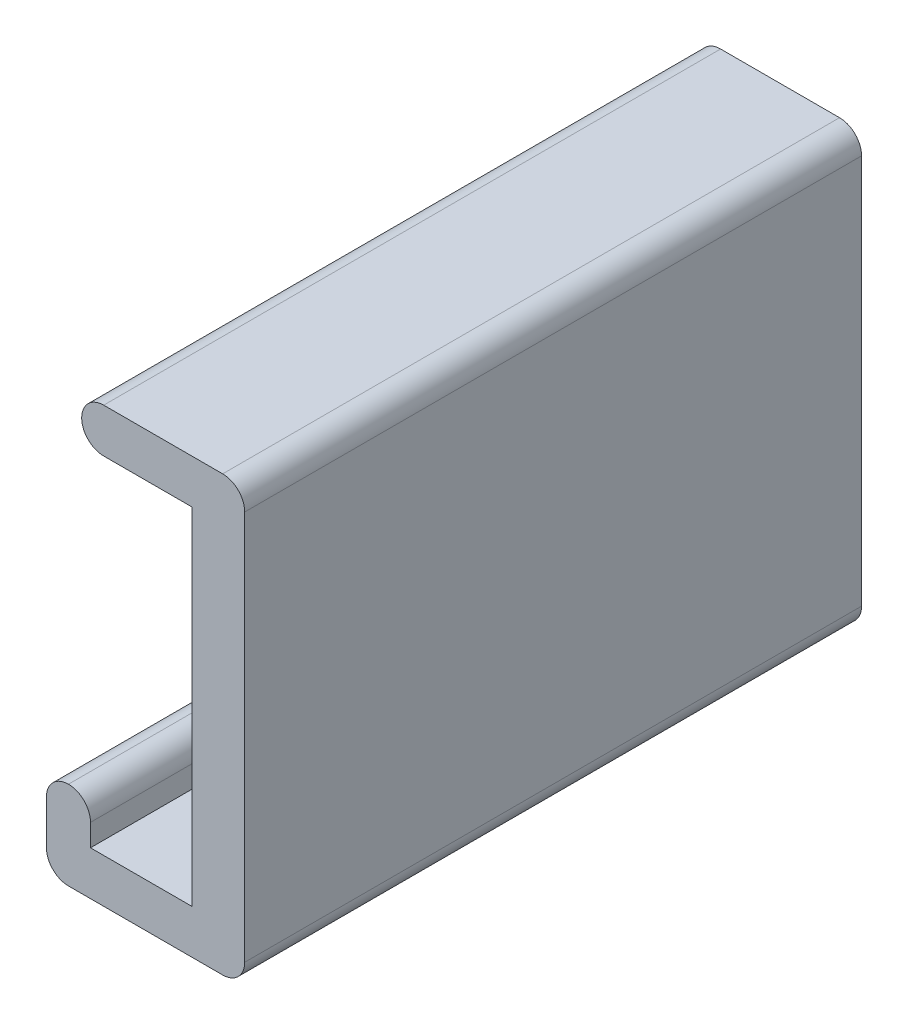
ISO-10303-21;
HEADER;
FILE_DESCRIPTION(('STEP AP214'),'2;1');
FILE_NAME('part.step','',(''),(''),'','','');
FILE_SCHEMA(('AUTOMOTIVE_DESIGN { 1 0 10303 214 1 1 1 1 }'));
ENDSEC;
DATA;
#1=APPLICATION_CONTEXT('core data for automotive mechanical design processes');
#2=APPLICATION_PROTOCOL_DEFINITION('international standard','automotive_design',2000,#1);
#3=PRODUCT_CONTEXT('',#1,'mechanical');
#4=PRODUCT('Part','Part','',(#3));
#5=PRODUCT_RELATED_PRODUCT_CATEGORY('part','',(#4));
#6=PRODUCT_DEFINITION_FORMATION('','',#4);
#7=PRODUCT_DEFINITION_CONTEXT('part definition',#1,'design');
#8=PRODUCT_DEFINITION('design','',#6,#7);
#9=PRODUCT_DEFINITION_SHAPE('','',#8);
#10=(LENGTH_UNIT() NAMED_UNIT(*) SI_UNIT(.MILLI.,.METRE.));
#11=(NAMED_UNIT(*) PLANE_ANGLE_UNIT() SI_UNIT($,.RADIAN.));
#12=(NAMED_UNIT(*) SI_UNIT($,.STERADIAN.) SOLID_ANGLE_UNIT());
#13=UNCERTAINTY_MEASURE_WITH_UNIT(LENGTH_MEASURE(1.E-05),#10,'distance_accuracy_value','');
#14=(GEOMETRIC_REPRESENTATION_CONTEXT(3) GLOBAL_UNCERTAINTY_ASSIGNED_CONTEXT((#13)) GLOBAL_UNIT_ASSIGNED_CONTEXT((#10,
#11,#12)) REPRESENTATION_CONTEXT('',''));
#15=CARTESIAN_POINT('',(0.,0.,0.));
#16=DIRECTION('',(0.,0.,1.));
#17=DIRECTION('',(1.,0.,0.));
#18=AXIS2_PLACEMENT_3D('',#15,#16,#17);
#19=CARTESIAN_POINT('',(-1.2,0.,14.));
#20=DIRECTION('',(1.,0.,0.));
#21=DIRECTION('',(0.,0.,-1.));
#22=AXIS2_PLACEMENT_3D('',#19,#20,#21);
#23=PLANE('',#22);
#24=DIRECTION('',(0.,-1.,0.));
#25=VECTOR('',#24,1.);
#26=CARTESIAN_POINT('',(-1.2,0.,0.));
#27=LINE('',#26,#25);
#28=CARTESIAN_POINT('',(-1.2,3.925,0.));
#29=VERTEX_POINT('',#28);
#30=CARTESIAN_POINT('',(-1.2,-3.92500000000001,0.));
#31=VERTEX_POINT('',#30);
#32=EDGE_CURVE('E164',#29,#31,#27,.T.);
#33=ORIENTED_EDGE('',*,*,#32,.T.);
#34=DIRECTION('',(0.,0.,-1.));
#35=VECTOR('',#34,1.);
#36=CARTESIAN_POINT('',(-1.2,-3.92500000000001,14.));
#37=LINE('',#36,#35);
#38=CARTESIAN_POINT('',(-1.2,-3.92500000000001,14.));
#39=VERTEX_POINT('',#38);
#40=EDGE_CURVE('E145',#39,#31,#37,.T.);
#41=ORIENTED_EDGE('',*,*,#40,.F.);
#42=DIRECTION('',(0.,-1.,0.));
#43=VECTOR('',#42,1.);
#44=CARTESIAN_POINT('',(-1.2,0.,14.));
#45=LINE('',#44,#43);
#46=CARTESIAN_POINT('',(-1.2,3.925,14.));
#47=VERTEX_POINT('',#46);
#48=EDGE_CURVE('E152',#47,#39,#45,.T.);
#49=ORIENTED_EDGE('',*,*,#48,.F.);
#50=DIRECTION('',(0.,0.,-1.));
#51=VECTOR('',#50,1.);
#52=CARTESIAN_POINT('',(-1.2,3.925,14.));
#53=LINE('',#52,#51);
#54=EDGE_CURVE('E169',#47,#29,#53,.T.);
#55=ORIENTED_EDGE('',*,*,#54,.T.);
#56=EDGE_LOOP('',(#33,#41,#49,#55));
#57=FACE_BOUND('',#56,.T.);
#58=ADVANCED_FACE('F33',(#57),#23,.F.);
#59=CARTESIAN_POINT('',(0.,-3.92500000000001,14.));
#60=DIRECTION('',(0.,-1.,0.));
#61=DIRECTION('',(1.,0.,0.));
#62=AXIS2_PLACEMENT_3D('',#59,#60,#61);
#63=PLANE('',#62);
#64=DIRECTION('',(-1.,0.,0.));
#65=VECTOR('',#64,1.);
#66=CARTESIAN_POINT('',(0.,-3.92500000000001,0.));
#67=LINE('',#66,#65);
#68=CARTESIAN_POINT('',(-3.5,-3.925,0.));
#69=VERTEX_POINT('',#68);
#70=EDGE_CURVE('E222',#31,#69,#67,.T.);
#71=ORIENTED_EDGE('',*,*,#70,.T.);
#72=DIRECTION('',(0.,0.,-1.));
#73=VECTOR('',#72,1.);
#74=CARTESIAN_POINT('',(-3.5,-3.925,14.));
#75=LINE('',#74,#73);
#76=CARTESIAN_POINT('',(-3.5,-3.925,14.));
#77=VERTEX_POINT('',#76);
#78=EDGE_CURVE('E148',#77,#69,#75,.T.);
#79=ORIENTED_EDGE('',*,*,#78,.F.);
#80=DIRECTION('',(-1.,0.,0.));
#81=VECTOR('',#80,1.);
#82=CARTESIAN_POINT('',(0.,-3.92500000000001,14.));
#83=LINE('',#82,#81);
#84=EDGE_CURVE('E141',#39,#77,#83,.T.);
#85=ORIENTED_EDGE('',*,*,#84,.F.);
#86=ORIENTED_EDGE('',*,*,#40,.T.);
#87=EDGE_LOOP('',(#71,#79,#85,#86));
#88=FACE_BOUND('',#87,.T.);
#89=ADVANCED_FACE('F143',(#88),#63,.F.);
#90=CARTESIAN_POINT('',(-3.5,0.,14.));
#91=DIRECTION('',(-1.,0.,0.));
#92=DIRECTION('',(0.,0.,1.));
#93=AXIS2_PLACEMENT_3D('',#90,#91,#92);
#94=PLANE('',#93);
#95=DIRECTION('',(0.,1.,0.));
#96=VECTOR('',#95,1.);
#97=CARTESIAN_POINT('',(-3.5,0.,0.));
#98=LINE('',#97,#96);
#99=CARTESIAN_POINT('',(-3.5,-3.425,0.));
#100=VERTEX_POINT('',#99);
#101=EDGE_CURVE('E257',#69,#100,#98,.T.);
#102=ORIENTED_EDGE('',*,*,#101,.T.);
#103=DIRECTION('',(0.,0.,-1.));
#104=VECTOR('',#103,1.);
#105=CARTESIAN_POINT('',(-3.5,-3.425,14.));
#106=LINE('',#105,#104);
#107=CARTESIAN_POINT('',(-3.5,-3.425,14.));
#108=VERTEX_POINT('',#107);
#109=EDGE_CURVE('E211',#100,#108,#106,.F.);
#110=ORIENTED_EDGE('',*,*,#109,.T.);
#111=DIRECTION('',(0.,1.,0.));
#112=VECTOR('',#111,1.);
#113=CARTESIAN_POINT('',(-3.5,0.,14.));
#114=LINE('',#113,#112);
#115=EDGE_CURVE('E151',#77,#108,#114,.T.);
#116=ORIENTED_EDGE('',*,*,#115,.F.);
#117=ORIENTED_EDGE('',*,*,#78,.T.);
#118=EDGE_LOOP('',(#102,#110,#116,#117));
#119=FACE_BOUND('',#118,.T.);
#120=ADVANCED_FACE('F315',(#119),#94,.F.);
#121=CARTESIAN_POINT('',(-4.5,0.,14.));
#122=DIRECTION('',(-1.,0.,0.));
#123=DIRECTION('',(0.,0.,1.));
#124=AXIS2_PLACEMENT_3D('',#121,#122,#123);
#125=PLANE('',#124);
#126=DIRECTION('',(0.,1.,0.));
#127=VECTOR('',#126,1.);
#128=CARTESIAN_POINT('',(-4.5,0.,0.));
#129=LINE('',#128,#127);
#130=CARTESIAN_POINT('',(-4.5,-4.425,0.));
#131=VERTEX_POINT('',#130);
#132=CARTESIAN_POINT('',(-4.5,-3.425,0.));
#133=VERTEX_POINT('',#132);
#134=EDGE_CURVE('E260',#131,#133,#129,.T.);
#135=ORIENTED_EDGE('',*,*,#134,.F.);
#136=DIRECTION('',(0.,0.,-1.));
#137=VECTOR('',#136,1.);
#138=CARTESIAN_POINT('',(-4.5,-4.425,14.));
#139=LINE('',#138,#137);
#140=CARTESIAN_POINT('',(-4.5,-4.425,14.));
#141=VERTEX_POINT('',#140);
#142=EDGE_CURVE('E209',#131,#141,#139,.F.);
#143=ORIENTED_EDGE('',*,*,#142,.T.);
#144=DIRECTION('',(0.,1.,0.));
#145=VECTOR('',#144,1.);
#146=CARTESIAN_POINT('',(-4.5,0.,14.));
#147=LINE('',#146,#145);
#148=CARTESIAN_POINT('',(-4.5,-3.425,14.));
#149=VERTEX_POINT('',#148);
#150=EDGE_CURVE('E281',#141,#149,#147,.T.);
#151=ORIENTED_EDGE('',*,*,#150,.T.);
#152=DIRECTION('',(0.,0.,-1.));
#153=VECTOR('',#152,1.);
#154=CARTESIAN_POINT('',(-4.5,-3.425,14.));
#155=LINE('',#154,#153);
#156=EDGE_CURVE('E206',#149,#133,#155,.T.);
#157=ORIENTED_EDGE('',*,*,#156,.T.);
#158=EDGE_LOOP('',(#135,#143,#151,#157));
#159=FACE_BOUND('',#158,.T.);
#160=ADVANCED_FACE('F297',(#159),#125,.T.);
#161=CARTESIAN_POINT('',(0.,-4.925,14.));
#162=DIRECTION('',(0.,-1.,0.));
#163=DIRECTION('',(1.,0.,0.));
#164=AXIS2_PLACEMENT_3D('',#161,#162,#163);
#165=PLANE('',#164);
#166=DIRECTION('',(-1.,0.,0.));
#167=VECTOR('',#166,1.);
#168=CARTESIAN_POINT('',(0.,-4.925,0.));
#169=LINE('',#168,#167);
#170=CARTESIAN_POINT('',(-0.5,-4.925,0.));
#171=VERTEX_POINT('',#170);
#172=CARTESIAN_POINT('',(-4.,-4.925,0.));
#173=VERTEX_POINT('',#172);
#174=EDGE_CURVE('E247',#171,#173,#169,.T.);
#175=ORIENTED_EDGE('',*,*,#174,.F.);
#176=DIRECTION('',(0.,0.,-1.));
#177=VECTOR('',#176,1.);
#178=CARTESIAN_POINT('',(-0.5,-4.925,14.));
#179=LINE('',#178,#177);
#180=CARTESIAN_POINT('',(-0.5,-4.925,14.));
#181=VERTEX_POINT('',#180);
#182=EDGE_CURVE('E192',#171,#181,#179,.F.);
#183=ORIENTED_EDGE('',*,*,#182,.T.);
#184=DIRECTION('',(-1.,0.,0.));
#185=VECTOR('',#184,1.);
#186=CARTESIAN_POINT('',(0.,-4.925,14.));
#187=LINE('',#186,#185);
#188=CARTESIAN_POINT('',(-4.,-4.925,14.));
#189=VERTEX_POINT('',#188);
#190=EDGE_CURVE('E277',#181,#189,#187,.T.);
#191=ORIENTED_EDGE('',*,*,#190,.T.);
#192=DIRECTION('',(0.,0.,-1.));
#193=VECTOR('',#192,1.);
#194=CARTESIAN_POINT('',(-4.,-4.925,14.));
#195=LINE('',#194,#193);
#196=EDGE_CURVE('E189',#189,#173,#195,.T.);
#197=ORIENTED_EDGE('',*,*,#196,.T.);
#198=EDGE_LOOP('',(#175,#183,#191,#197));
#199=FACE_BOUND('',#198,.T.);
#200=ADVANCED_FACE('F267',(#199),#165,.T.);
#201=CARTESIAN_POINT('',(0.,0.,14.));
#202=DIRECTION('',(-1.,0.,0.));
#203=DIRECTION('',(0.,0.,1.));
#204=AXIS2_PLACEMENT_3D('',#201,#202,#203);
#205=PLANE('',#204);
#206=DIRECTION('',(0.,1.,0.));
#207=VECTOR('',#206,1.);
#208=CARTESIAN_POINT('',(0.,0.,14.));
#209=LINE('',#208,#207);
#210=CARTESIAN_POINT('',(0.,-4.425,14.));
#211=VERTEX_POINT('',#210);
#212=CARTESIAN_POINT('',(0.,4.425,14.));
#213=VERTEX_POINT('',#212);
#214=EDGE_CURVE('E252',#211,#213,#209,.T.);
#215=ORIENTED_EDGE('',*,*,#214,.F.);
#216=DIRECTION('',(0.,0.,-1.));
#217=VECTOR('',#216,1.);
#218=CARTESIAN_POINT('',(0.,-4.425,0.));
#219=LINE('',#218,#217);
#220=CARTESIAN_POINT('',(0.,-4.425,0.));
#221=VERTEX_POINT('',#220);
#222=EDGE_CURVE('E167',#211,#221,#219,.T.);
#223=ORIENTED_EDGE('',*,*,#222,.T.);
#224=DIRECTION('',(0.,1.,0.));
#225=VECTOR('',#224,1.);
#226=CARTESIAN_POINT('',(0.,0.,0.));
#227=LINE('',#226,#225);
#228=CARTESIAN_POINT('',(0.,4.425,0.));
#229=VERTEX_POINT('',#228);
#230=EDGE_CURVE('E243',#221,#229,#227,.T.);
#231=ORIENTED_EDGE('',*,*,#230,.T.);
#232=DIRECTION('',(0.,0.,-1.));
#233=VECTOR('',#232,1.);
#234=CARTESIAN_POINT('',(0.,4.425,14.));
#235=LINE('',#234,#233);
#236=EDGE_CURVE('E165',#229,#213,#235,.F.);
#237=ORIENTED_EDGE('',*,*,#236,.T.);
#238=EDGE_LOOP('',(#215,#223,#231,#237));
#239=FACE_BOUND('',#238,.T.);
#240=ADVANCED_FACE('F279',(#239),#205,.F.);
#241=CARTESIAN_POINT('',(0.,4.925,14.));
#242=DIRECTION('',(0.,-1.,0.));
#243=DIRECTION('',(1.,0.,0.));
#244=AXIS2_PLACEMENT_3D('',#241,#242,#243);
#245=PLANE('',#244);
#246=DIRECTION('',(-1.,0.,0.));
#247=VECTOR('',#246,1.);
#248=CARTESIAN_POINT('',(0.,4.925,0.));
#249=LINE('',#248,#247);
#250=CARTESIAN_POINT('',(-0.5,4.925,0.));
#251=VERTEX_POINT('',#250);
#252=CARTESIAN_POINT('',(-3.2,4.925,0.));
#253=VERTEX_POINT('',#252);
#254=EDGE_CURVE('E237',#251,#253,#249,.T.);
#255=ORIENTED_EDGE('',*,*,#254,.T.);
#256=DIRECTION('',(0.,0.,-1.));
#257=VECTOR('',#256,1.);
#258=CARTESIAN_POINT('',(-3.2,4.925,14.));
#259=LINE('',#258,#257);
#260=CARTESIAN_POINT('',(-3.2,4.925,14.));
#261=VERTEX_POINT('',#260);
#262=EDGE_CURVE('E11',#253,#261,#259,.F.);
#263=ORIENTED_EDGE('',*,*,#262,.T.);
#264=DIRECTION('',(-1.,0.,0.));
#265=VECTOR('',#264,1.);
#266=CARTESIAN_POINT('',(0.,4.925,14.));
#267=LINE('',#266,#265);
#268=CARTESIAN_POINT('',(-0.5,4.925,14.));
#269=VERTEX_POINT('',#268);
#270=EDGE_CURVE('E250',#269,#261,#267,.T.);
#271=ORIENTED_EDGE('',*,*,#270,.F.);
#272=DIRECTION('',(0.,0.,-1.));
#273=VECTOR('',#272,1.);
#274=CARTESIAN_POINT('',(-0.5,4.925,14.));
#275=LINE('',#274,#273);
#276=EDGE_CURVE('E42',#269,#251,#275,.T.);
#277=ORIENTED_EDGE('',*,*,#276,.T.);
#278=EDGE_LOOP('',(#255,#263,#271,#277));
#279=FACE_BOUND('',#278,.T.);
#280=ADVANCED_FACE('F240',(#279),#245,.F.);
#281=CARTESIAN_POINT('',(0.,3.925,14.));
#282=DIRECTION('',(0.,1.,0.));
#283=DIRECTION('',(0.,0.,1.));
#284=AXIS2_PLACEMENT_3D('',#281,#282,#283);
#285=PLANE('',#284);
#286=DIRECTION('',(1.,0.,0.));
#287=VECTOR('',#286,1.);
#288=CARTESIAN_POINT('',(0.,3.925,14.));
#289=LINE('',#288,#287);
#290=CARTESIAN_POINT('',(-3.2,3.925,14.));
#291=VERTEX_POINT('',#290);
#292=EDGE_CURVE('E157',#291,#47,#289,.T.);
#293=ORIENTED_EDGE('',*,*,#292,.F.);
#294=DIRECTION('',(0.,0.,-1.));
#295=VECTOR('',#294,1.);
#296=CARTESIAN_POINT('',(-3.2,3.925,14.));
#297=LINE('',#296,#295);
#298=CARTESIAN_POINT('',(-3.2,3.925,0.));
#299=VERTEX_POINT('',#298);
#300=EDGE_CURVE('E213',#291,#299,#297,.T.);
#301=ORIENTED_EDGE('',*,*,#300,.T.);
#302=DIRECTION('',(1.,0.,0.));
#303=VECTOR('',#302,1.);
#304=CARTESIAN_POINT('',(0.,3.925,0.));
#305=LINE('',#304,#303);
#306=EDGE_CURVE('E161',#299,#29,#305,.T.);
#307=ORIENTED_EDGE('',*,*,#306,.T.);
#308=ORIENTED_EDGE('',*,*,#54,.F.);
#309=EDGE_LOOP('',(#293,#301,#307,#308));
#310=FACE_BOUND('',#309,.T.);
#311=ADVANCED_FACE('F328',(#310),#285,.F.);
#312=CARTESIAN_POINT('',(0.,0.,14.));
#313=DIRECTION('',(0.,0.,1.));
#314=DIRECTION('',(1.,0.,0.));
#315=AXIS2_PLACEMENT_3D('',#312,#313,#314);
#316=PLANE('',#315);
#317=ORIENTED_EDGE('',*,*,#190,.F.);
#318=CARTESIAN_POINT('',(-0.5,-4.425,14.));
#319=DIRECTION('',(0.,0.,1.));
#320=DIRECTION('',(1.,0.,0.));
#321=AXIS2_PLACEMENT_3D('',#318,#319,#320);
#322=CIRCLE('',#321,0.5);
#323=EDGE_CURVE('E204',#181,#211,#322,.T.);
#324=ORIENTED_EDGE('',*,*,#323,.T.);
#325=ORIENTED_EDGE('',*,*,#214,.T.);
#326=CARTESIAN_POINT('',(-0.5,4.425,14.));
#327=DIRECTION('',(0.,0.,1.));
#328=DIRECTION('',(1.,0.,0.));
#329=AXIS2_PLACEMENT_3D('',#326,#327,#328);
#330=CIRCLE('',#329,0.5);
#331=EDGE_CURVE('E194',#213,#269,#330,.T.);
#332=ORIENTED_EDGE('',*,*,#331,.T.);
#333=ORIENTED_EDGE('',*,*,#270,.T.);
#334=CARTESIAN_POINT('',(-3.2,4.425,14.));
#335=DIRECTION('',(0.,0.,1.));
#336=DIRECTION('',(1.,0.,0.));
#337=AXIS2_PLACEMENT_3D('',#334,#335,#336);
#338=CIRCLE('',#337,0.5);
#339=CARTESIAN_POINT('',(-3.7,4.425,14.));
#340=VERTEX_POINT('',#339);
#341=EDGE_CURVE('E55',#261,#340,#338,.T.);
#342=ORIENTED_EDGE('',*,*,#341,.T.);
#343=CARTESIAN_POINT('',(-3.2,4.425,14.));
#344=DIRECTION('',(0.,0.,1.));
#345=DIRECTION('',(1.,0.,0.));
#346=AXIS2_PLACEMENT_3D('',#343,#344,#345);
#347=CIRCLE('',#346,0.5);
#348=EDGE_CURVE('E50',#340,#291,#347,.T.);
#349=ORIENTED_EDGE('',*,*,#348,.T.);
#350=ORIENTED_EDGE('',*,*,#292,.T.);
#351=ORIENTED_EDGE('',*,*,#48,.T.);
#352=ORIENTED_EDGE('',*,*,#84,.T.);
#353=ORIENTED_EDGE('',*,*,#115,.T.);
#354=CARTESIAN_POINT('',(-4.,-3.425,14.));
#355=DIRECTION('',(0.,0.,1.));
#356=DIRECTION('',(1.,0.,0.));
#357=AXIS2_PLACEMENT_3D('',#354,#355,#356);
#358=CIRCLE('',#357,0.5);
#359=CARTESIAN_POINT('',(-4.,-2.925,14.));
#360=VERTEX_POINT('',#359);
#361=EDGE_CURVE('E198',#108,#360,#358,.T.);
#362=ORIENTED_EDGE('',*,*,#361,.T.);
#363=CARTESIAN_POINT('',(-4.,-3.425,14.));
#364=DIRECTION('',(0.,0.,1.));
#365=DIRECTION('',(1.,0.,0.));
#366=AXIS2_PLACEMENT_3D('',#363,#364,#365);
#367=CIRCLE('',#366,0.5);
#368=EDGE_CURVE('E200',#360,#149,#367,.T.);
#369=ORIENTED_EDGE('',*,*,#368,.T.);
#370=ORIENTED_EDGE('',*,*,#150,.F.);
#371=CARTESIAN_POINT('',(-4.,-4.425,14.));
#372=DIRECTION('',(0.,0.,1.));
#373=DIRECTION('',(1.,0.,0.));
#374=AXIS2_PLACEMENT_3D('',#371,#372,#373);
#375=CIRCLE('',#374,0.5);
#376=EDGE_CURVE('E202',#141,#189,#375,.T.);
#377=ORIENTED_EDGE('',*,*,#376,.T.);
#378=EDGE_LOOP('',(#317,#324,#325,#332,#333,#342,#349,#350,#351,#352,#353,#362,#369,#370,#377));
#379=FACE_BOUND('',#378,.T.);
#380=ADVANCED_FACE('F156',(#379),#316,.T.);
#381=CARTESIAN_POINT('',(0.,0.,0.));
#382=DIRECTION('',(0.,0.,1.));
#383=DIRECTION('',(1.,0.,0.));
#384=AXIS2_PLACEMENT_3D('',#381,#382,#383);
#385=PLANE('',#384);
#386=ORIENTED_EDGE('',*,*,#230,.F.);
#387=CARTESIAN_POINT('',(-0.5,-4.425,0.));
#388=DIRECTION('',(0.,0.,1.));
#389=DIRECTION('',(1.,0.,0.));
#390=AXIS2_PLACEMENT_3D('',#387,#388,#389);
#391=CIRCLE('',#390,0.5);
#392=EDGE_CURVE('E187',#221,#171,#391,.F.);
#393=ORIENTED_EDGE('',*,*,#392,.T.);
#394=ORIENTED_EDGE('',*,*,#174,.T.);
#395=CARTESIAN_POINT('',(-4.,-4.425,0.));
#396=DIRECTION('',(0.,0.,1.));
#397=DIRECTION('',(1.,0.,0.));
#398=AXIS2_PLACEMENT_3D('',#395,#396,#397);
#399=CIRCLE('',#398,0.5);
#400=EDGE_CURVE('E185',#173,#131,#399,.F.);
#401=ORIENTED_EDGE('',*,*,#400,.T.);
#402=ORIENTED_EDGE('',*,*,#134,.T.);
#403=CARTESIAN_POINT('',(-4.,-3.425,0.));
#404=DIRECTION('',(0.,0.,1.));
#405=DIRECTION('',(1.,0.,0.));
#406=AXIS2_PLACEMENT_3D('',#403,#404,#405);
#407=CIRCLE('',#406,0.5);
#408=CARTESIAN_POINT('',(-4.,-2.925,0.));
#409=VERTEX_POINT('',#408);
#410=EDGE_CURVE('E183',#133,#409,#407,.F.);
#411=ORIENTED_EDGE('',*,*,#410,.T.);
#412=CARTESIAN_POINT('',(-4.,-3.425,0.));
#413=DIRECTION('',(0.,0.,1.));
#414=DIRECTION('',(1.,0.,0.));
#415=AXIS2_PLACEMENT_3D('',#412,#413,#414);
#416=CIRCLE('',#415,0.5);
#417=EDGE_CURVE('E181',#409,#100,#416,.F.);
#418=ORIENTED_EDGE('',*,*,#417,.T.);
#419=ORIENTED_EDGE('',*,*,#101,.F.);
#420=ORIENTED_EDGE('',*,*,#70,.F.);
#421=ORIENTED_EDGE('',*,*,#32,.F.);
#422=ORIENTED_EDGE('',*,*,#306,.F.);
#423=CARTESIAN_POINT('',(-3.2,4.425,0.));
#424=DIRECTION('',(0.,0.,1.));
#425=DIRECTION('',(1.,0.,0.));
#426=AXIS2_PLACEMENT_3D('',#423,#424,#425);
#427=CIRCLE('',#426,0.5);
#428=CARTESIAN_POINT('',(-3.7,4.425,0.));
#429=VERTEX_POINT('',#428);
#430=EDGE_CURVE('E179',#299,#429,#427,.F.);
#431=ORIENTED_EDGE('',*,*,#430,.T.);
#432=CARTESIAN_POINT('',(-3.2,4.425,0.));
#433=DIRECTION('',(0.,0.,1.));
#434=DIRECTION('',(1.,0.,0.));
#435=AXIS2_PLACEMENT_3D('',#432,#433,#434);
#436=CIRCLE('',#435,0.5);
#437=EDGE_CURVE('E177',#429,#253,#436,.F.);
#438=ORIENTED_EDGE('',*,*,#437,.T.);
#439=ORIENTED_EDGE('',*,*,#254,.F.);
#440=CARTESIAN_POINT('',(-0.5,4.425,0.));
#441=DIRECTION('',(0.,0.,1.));
#442=DIRECTION('',(1.,0.,0.));
#443=AXIS2_PLACEMENT_3D('',#440,#441,#442);
#444=CIRCLE('',#443,0.5);
#445=EDGE_CURVE('E175',#251,#229,#444,.F.);
#446=ORIENTED_EDGE('',*,*,#445,.T.);
#447=EDGE_LOOP('',(#386,#393,#394,#401,#402,#411,#418,#419,#420,#421,#422,#431,#438,#439,#446));
#448=FACE_BOUND('',#447,.T.);
#449=ADVANCED_FACE('F236',(#448),#385,.F.);
#450=CARTESIAN_POINT('',(-0.5,-4.425,14.));
#451=DIRECTION('',(0.,0.,1.));
#452=DIRECTION('',(1.,0.,0.));
#453=AXIS2_PLACEMENT_3D('',#450,#451,#452);
#454=CYLINDRICAL_SURFACE('',#453,0.5);
#455=ORIENTED_EDGE('',*,*,#323,.F.);
#456=ORIENTED_EDGE('',*,*,#182,.F.);
#457=ORIENTED_EDGE('',*,*,#392,.F.);
#458=ORIENTED_EDGE('',*,*,#222,.F.);
#459=EDGE_LOOP('',(#455,#456,#457,#458));
#460=FACE_BOUND('',#459,.T.);
#461=ADVANCED_FACE('F272',(#460),#454,.T.);
#462=CARTESIAN_POINT('',(-4.,-4.425,14.));
#463=DIRECTION('',(0.,0.,-1.));
#464=DIRECTION('',(-1.,0.,0.));
#465=AXIS2_PLACEMENT_3D('',#462,#463,#464);
#466=CYLINDRICAL_SURFACE('',#465,0.5);
#467=ORIENTED_EDGE('',*,*,#376,.F.);
#468=ORIENTED_EDGE('',*,*,#142,.F.);
#469=ORIENTED_EDGE('',*,*,#400,.F.);
#470=ORIENTED_EDGE('',*,*,#196,.F.);
#471=EDGE_LOOP('',(#467,#468,#469,#470));
#472=FACE_BOUND('',#471,.T.);
#473=ADVANCED_FACE('F300',(#472),#466,.T.);
#474=CARTESIAN_POINT('',(-4.,-3.425,14.));
#475=DIRECTION('',(0.,0.,1.));
#476=DIRECTION('',(1.,0.,0.));
#477=AXIS2_PLACEMENT_3D('',#474,#475,#476);
#478=CYLINDRICAL_SURFACE('',#477,0.5);
#479=DIRECTION('',(0.,0.,-1.));
#480=VECTOR('',#479,1.);
#481=CARTESIAN_POINT('',(-4.,-2.925,0.));
#482=LINE('',#481,#480);
#483=EDGE_CURVE('E217',#360,#409,#482,.T.);
#484=ORIENTED_EDGE('',*,*,#483,.F.);
#485=ORIENTED_EDGE('',*,*,#361,.F.);
#486=ORIENTED_EDGE('',*,*,#109,.F.);
#487=ORIENTED_EDGE('',*,*,#417,.F.);
#488=EDGE_LOOP('',(#484,#485,#486,#487));
#489=FACE_BOUND('',#488,.T.);
#490=ADVANCED_FACE('F290',(#489),#478,.T.);
#491=CARTESIAN_POINT('',(-4.,-3.425,14.));
#492=DIRECTION('',(0.,0.,-1.));
#493=DIRECTION('',(-1.,0.,0.));
#494=AXIS2_PLACEMENT_3D('',#491,#492,#493);
#495=CYLINDRICAL_SURFACE('',#494,0.5);
#496=ORIENTED_EDGE('',*,*,#368,.F.);
#497=ORIENTED_EDGE('',*,*,#483,.T.);
#498=ORIENTED_EDGE('',*,*,#410,.F.);
#499=ORIENTED_EDGE('',*,*,#156,.F.);
#500=EDGE_LOOP('',(#496,#497,#498,#499));
#501=FACE_BOUND('',#500,.T.);
#502=ADVANCED_FACE('F293',(#501),#495,.T.);
#503=CARTESIAN_POINT('',(-3.2,4.425,14.));
#504=DIRECTION('',(0.,0.,-1.));
#505=DIRECTION('',(-1.,0.,0.));
#506=AXIS2_PLACEMENT_3D('',#503,#504,#505);
#507=CYLINDRICAL_SURFACE('',#506,0.5);
#508=DIRECTION('',(0.,0.,-1.));
#509=VECTOR('',#508,1.);
#510=CARTESIAN_POINT('',(-3.7,4.425,14.));
#511=LINE('',#510,#509);
#512=EDGE_CURVE('E37',#340,#429,#511,.T.);
#513=ORIENTED_EDGE('',*,*,#512,.F.);
#514=ORIENTED_EDGE('',*,*,#341,.F.);
#515=ORIENTED_EDGE('',*,*,#262,.F.);
#516=ORIENTED_EDGE('',*,*,#437,.F.);
#517=EDGE_LOOP('',(#513,#514,#515,#516));
#518=FACE_BOUND('',#517,.T.);
#519=ADVANCED_FACE('F230',(#518),#507,.T.);
#520=CARTESIAN_POINT('',(-3.2,4.425,14.));
#521=DIRECTION('',(0.,0.,-1.));
#522=DIRECTION('',(-1.,0.,0.));
#523=AXIS2_PLACEMENT_3D('',#520,#521,#522);
#524=CYLINDRICAL_SURFACE('',#523,0.5);
#525=ORIENTED_EDGE('',*,*,#348,.F.);
#526=ORIENTED_EDGE('',*,*,#512,.T.);
#527=ORIENTED_EDGE('',*,*,#430,.F.);
#528=ORIENTED_EDGE('',*,*,#300,.F.);
#529=EDGE_LOOP('',(#525,#526,#527,#528));
#530=FACE_BOUND('',#529,.T.);
#531=ADVANCED_FACE('F226',(#530),#524,.T.);
#532=CARTESIAN_POINT('',(-0.5,4.425,14.));
#533=DIRECTION('',(0.,0.,-1.));
#534=DIRECTION('',(-1.,0.,0.));
#535=AXIS2_PLACEMENT_3D('',#532,#533,#534);
#536=CYLINDRICAL_SURFACE('',#535,0.5);
#537=ORIENTED_EDGE('',*,*,#331,.F.);
#538=ORIENTED_EDGE('',*,*,#236,.F.);
#539=ORIENTED_EDGE('',*,*,#445,.F.);
#540=ORIENTED_EDGE('',*,*,#276,.F.);
#541=EDGE_LOOP('',(#537,#538,#539,#540));
#542=FACE_BOUND('',#541,.T.);
#543=ADVANCED_FACE('F35',(#542),#536,.T.);
#544=CLOSED_SHELL('',(#58,#89,#120,#160,#200,#240,#280,#311,#380,#449,#461,#473,#490,#502,#519,
#531,#543));
#545=MANIFOLD_SOLID_BREP('B2',#544);
#546=ADVANCED_BREP_SHAPE_REPRESENTATION('',(#18,#545),#14);
#547=SHAPE_DEFINITION_REPRESENTATION(#9,#546);
ENDSEC;
END-ISO-10303-21;
